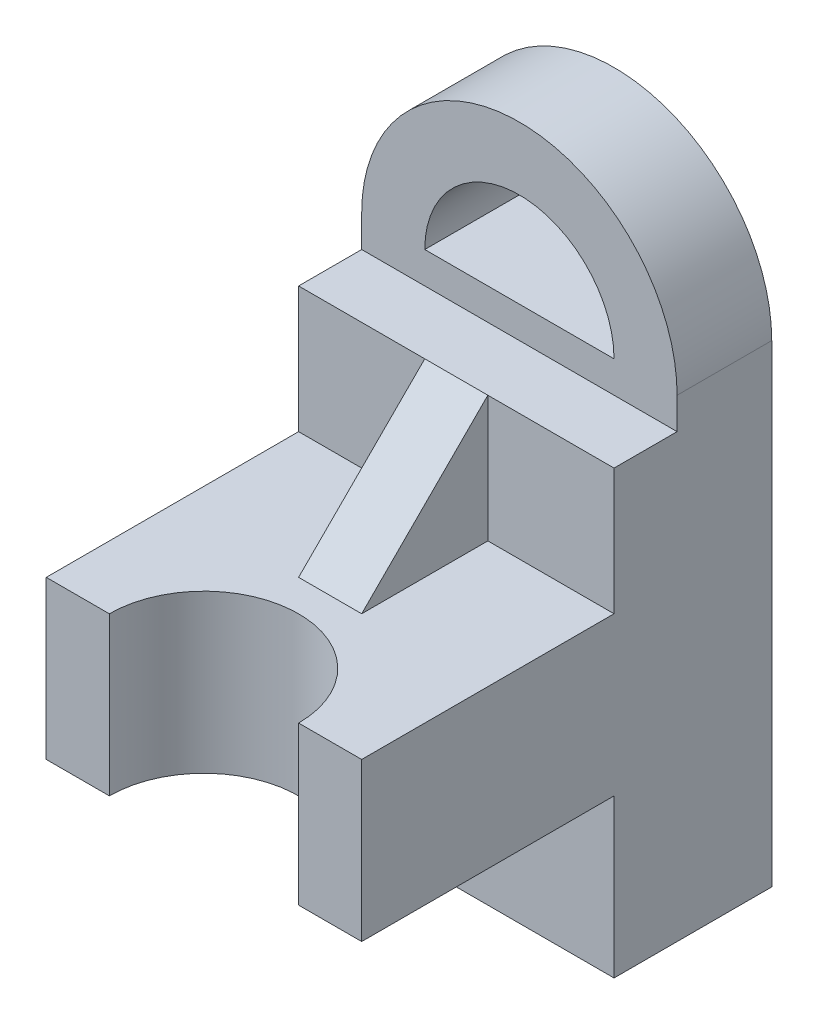
ISO-10303-21;
HEADER;
FILE_DESCRIPTION(('STEP AP214'),'2;1');
FILE_NAME('part.step','',(''),(''),'','','');
FILE_SCHEMA(('AUTOMOTIVE_DESIGN { 1 0 10303 214 1 1 1 1 }'));
ENDSEC;
DATA;
#1=APPLICATION_CONTEXT('core data for automotive mechanical design processes');
#2=APPLICATION_PROTOCOL_DEFINITION('international standard','automotive_design',2000,#1);
#3=PRODUCT_CONTEXT('',#1,'mechanical');
#4=PRODUCT('Part','Part','',(#3));
#5=PRODUCT_RELATED_PRODUCT_CATEGORY('part','',(#4));
#6=PRODUCT_DEFINITION_FORMATION('','',#4);
#7=PRODUCT_DEFINITION_CONTEXT('part definition',#1,'design');
#8=PRODUCT_DEFINITION('design','',#6,#7);
#9=PRODUCT_DEFINITION_SHAPE('','',#8);
#10=(LENGTH_UNIT() NAMED_UNIT(*) SI_UNIT(.MILLI.,.METRE.));
#11=(NAMED_UNIT(*) PLANE_ANGLE_UNIT() SI_UNIT($,.RADIAN.));
#12=(NAMED_UNIT(*) SI_UNIT($,.STERADIAN.) SOLID_ANGLE_UNIT());
#13=UNCERTAINTY_MEASURE_WITH_UNIT(LENGTH_MEASURE(1.E-05),#10,'distance_accuracy_value','');
#14=(GEOMETRIC_REPRESENTATION_CONTEXT(3) GLOBAL_UNCERTAINTY_ASSIGNED_CONTEXT((#13)) GLOBAL_UNIT_ASSIGNED_CONTEXT((#10,
#11,#12)) REPRESENTATION_CONTEXT('',''));
#15=CARTESIAN_POINT('',(0.,0.,0.));
#16=DIRECTION('',(0.,0.,1.));
#17=DIRECTION('',(1.,0.,0.));
#18=AXIS2_PLACEMENT_3D('',#15,#16,#17);
#19=CARTESIAN_POINT('',(25.,-12.5,65.));
#20=DIRECTION('',(0.,0.,1.));
#21=DIRECTION('',(1.,0.,0.));
#22=AXIS2_PLACEMENT_3D('',#19,#20,#21);
#23=PLANE('',#22);
#24=DIRECTION('',(0.,1.,0.));
#25=VECTOR('',#24,1.);
#26=CARTESIAN_POINT('',(15.,-12.5,65.));
#27=LINE('',#26,#25);
#28=CARTESIAN_POINT('',(15.,-12.5,65.));
#29=VERTEX_POINT('',#28);
#30=CARTESIAN_POINT('',(15.,12.5,65.));
#31=VERTEX_POINT('',#30);
#32=EDGE_CURVE('E155',#29,#31,#27,.T.);
#33=ORIENTED_EDGE('',*,*,#32,.F.);
#34=DIRECTION('',(-1.,0.,0.));
#35=VECTOR('',#34,1.);
#36=CARTESIAN_POINT('',(25.,-12.5,65.));
#37=LINE('',#36,#35);
#38=CARTESIAN_POINT('',(25.,-12.5,65.));
#39=VERTEX_POINT('',#38);
#40=EDGE_CURVE('E163',#39,#29,#37,.T.);
#41=ORIENTED_EDGE('',*,*,#40,.F.);
#42=DIRECTION('',(0.,1.,0.));
#43=VECTOR('',#42,1.);
#44=CARTESIAN_POINT('',(25.,-12.5,65.));
#45=LINE('',#44,#43);
#46=CARTESIAN_POINT('',(25.,12.5,65.));
#47=VERTEX_POINT('',#46);
#48=EDGE_CURVE('E322',#39,#47,#45,.T.);
#49=ORIENTED_EDGE('',*,*,#48,.T.);
#50=DIRECTION('',(-1.,0.,0.));
#51=VECTOR('',#50,1.);
#52=CARTESIAN_POINT('',(25.,12.5,65.));
#53=LINE('',#52,#51);
#54=EDGE_CURVE('E165',#47,#31,#53,.T.);
#55=ORIENTED_EDGE('',*,*,#54,.T.);
#56=EDGE_LOOP('',(#33,#41,#49,#55));
#57=FACE_BOUND('',#56,.T.);
#58=ADVANCED_FACE('F37',(#57),#23,.T.);
#59=CARTESIAN_POINT('',(0.,0.,25.));
#60=DIRECTION('',(0.,0.,1.));
#61=DIRECTION('',(1.,0.,0.));
#62=AXIS2_PLACEMENT_3D('',#59,#60,#61);
#63=PLANE('',#62);
#64=DIRECTION('',(-1.,0.,0.));
#65=VECTOR('',#64,1.);
#66=CARTESIAN_POINT('',(25.,12.5,25.));
#67=LINE('',#66,#65);
#68=CARTESIAN_POINT('',(-5.,12.5,25.));
#69=VERTEX_POINT('',#68);
#70=CARTESIAN_POINT('',(-25.,12.5,25.));
#71=VERTEX_POINT('',#70);
#72=EDGE_CURVE('E283',#69,#71,#67,.T.);
#73=ORIENTED_EDGE('',*,*,#72,.F.);
#74=DIRECTION('',(0.,1.,0.));
#75=VECTOR('',#74,1.);
#76=CARTESIAN_POINT('',(-5.,0.,25.));
#77=LINE('',#76,#75);
#78=CARTESIAN_POINT('',(-5.,32.5,25.));
#79=VERTEX_POINT('',#78);
#80=EDGE_CURVE('E59',#69,#79,#77,.T.);
#81=ORIENTED_EDGE('',*,*,#80,.T.);
#82=DIRECTION('',(1.,0.,0.));
#83=VECTOR('',#82,1.);
#84=CARTESIAN_POINT('',(-25.,32.5,25.));
#85=LINE('',#84,#83);
#86=CARTESIAN_POINT('',(-25.,32.5,25.));
#87=VERTEX_POINT('',#86);
#88=EDGE_CURVE('E181',#87,#79,#85,.T.);
#89=ORIENTED_EDGE('',*,*,#88,.F.);
#90=DIRECTION('',(0.,1.,0.));
#91=VECTOR('',#90,1.);
#92=CARTESIAN_POINT('',(-25.,-37.5,25.));
#93=LINE('',#92,#91);
#94=EDGE_CURVE('E191',#71,#87,#93,.T.);
#95=ORIENTED_EDGE('',*,*,#94,.F.);
#96=EDGE_LOOP('',(#73,#81,#89,#95));
#97=FACE_BOUND('',#96,.T.);
#98=ADVANCED_FACE('F296',(#97),#63,.T.);
#99=DIRECTION('',(-1.,0.,0.));
#100=VECTOR('',#99,1.);
#101=CARTESIAN_POINT('',(25.,-12.5,25.));
#102=LINE('',#101,#100);
#103=CARTESIAN_POINT('',(25.,-12.5,25.));
#104=VERTEX_POINT('',#103);
#105=CARTESIAN_POINT('',(-25.,-12.5,25.));
#106=VERTEX_POINT('',#105);
#107=EDGE_CURVE('E176',#104,#106,#102,.T.);
#108=ORIENTED_EDGE('',*,*,#107,.T.);
#109=CARTESIAN_POINT('',(-25.,-37.5,25.));
#110=VERTEX_POINT('',#109);
#111=EDGE_CURVE('E192',#110,#106,#93,.T.);
#112=ORIENTED_EDGE('',*,*,#111,.F.);
#113=DIRECTION('',(1.,0.,0.));
#114=VECTOR('',#113,1.);
#115=CARTESIAN_POINT('',(-25.,-37.5,25.));
#116=LINE('',#115,#114);
#117=CARTESIAN_POINT('',(25.,-37.5,25.));
#118=VERTEX_POINT('',#117);
#119=EDGE_CURVE('E189',#110,#118,#116,.T.);
#120=ORIENTED_EDGE('',*,*,#119,.T.);
#121=DIRECTION('',(0.,1.,0.));
#122=VECTOR('',#121,1.);
#123=CARTESIAN_POINT('',(25.,-37.5,25.));
#124=LINE('',#123,#122);
#125=EDGE_CURVE('E186',#118,#104,#124,.T.);
#126=ORIENTED_EDGE('',*,*,#125,.T.);
#127=EDGE_LOOP('',(#108,#112,#120,#126));
#128=FACE_BOUND('',#127,.T.);
#129=ADVANCED_FACE('F264',(#128),#63,.T.);
#130=CARTESIAN_POINT('',(0.,37.5,15.));
#131=DIRECTION('',(0.,0.,1.));
#132=DIRECTION('',(1.,0.,0.));
#133=AXIS2_PLACEMENT_3D('',#130,#131,#132);
#134=PLANE('',#133);
#135=CARTESIAN_POINT('',(0.,37.5,15.));
#136=DIRECTION('',(0.,0.,1.));
#137=DIRECTION('',(1.,0.,0.));
#138=AXIS2_PLACEMENT_3D('',#135,#136,#137);
#139=CIRCLE('',#138,15.);
#140=CARTESIAN_POINT('',(15.,37.5,15.));
#141=VERTEX_POINT('',#140);
#142=CARTESIAN_POINT('',(-15.,37.5,15.));
#143=VERTEX_POINT('',#142);
#144=EDGE_CURVE('E201',#141,#143,#139,.T.);
#145=ORIENTED_EDGE('',*,*,#144,.F.);
#146=DIRECTION('',(1.,0.,0.));
#147=VECTOR('',#146,1.);
#148=CARTESIAN_POINT('',(-15.,37.5,15.));
#149=LINE('',#148,#147);
#150=EDGE_CURVE('E207',#143,#141,#149,.T.);
#151=ORIENTED_EDGE('',*,*,#150,.F.);
#152=EDGE_LOOP('',(#145,#151));
#153=FACE_BOUND('',#152,.T.);
#154=DIRECTION('',(1.,0.,0.));
#155=VECTOR('',#154,1.);
#156=CARTESIAN_POINT('',(-25.,32.5,15.));
#157=LINE('',#156,#155);
#158=CARTESIAN_POINT('',(-25.,32.5,15.));
#159=VERTEX_POINT('',#158);
#160=CARTESIAN_POINT('',(25.,32.5,15.));
#161=VERTEX_POINT('',#160);
#162=EDGE_CURVE('E196',#159,#161,#157,.T.);
#163=ORIENTED_EDGE('',*,*,#162,.T.);
#164=DIRECTION('',(0.,1.,0.));
#165=VECTOR('',#164,1.);
#166=CARTESIAN_POINT('',(25.,37.5,15.));
#167=LINE('',#166,#165);
#168=CARTESIAN_POINT('',(25.,37.5,15.));
#169=VERTEX_POINT('',#168);
#170=EDGE_CURVE('E218',#161,#169,#167,.T.);
#171=ORIENTED_EDGE('',*,*,#170,.T.);
#172=CARTESIAN_POINT('',(0.,37.5,15.));
#173=DIRECTION('',(0.,0.,1.));
#174=DIRECTION('',(1.,0.,0.));
#175=AXIS2_PLACEMENT_3D('',#172,#173,#174);
#176=CIRCLE('',#175,25.);
#177=CARTESIAN_POINT('',(-25.,37.5,15.));
#178=VERTEX_POINT('',#177);
#179=EDGE_CURVE('E220',#169,#178,#176,.T.);
#180=ORIENTED_EDGE('',*,*,#179,.T.);
#181=DIRECTION('',(0.,-1.,0.));
#182=VECTOR('',#181,1.);
#183=CARTESIAN_POINT('',(-25.,37.5,15.));
#184=LINE('',#183,#182);
#185=EDGE_CURVE('E223',#178,#159,#184,.T.);
#186=ORIENTED_EDGE('',*,*,#185,.T.);
#187=EDGE_LOOP('',(#163,#171,#180,#186));
#188=FACE_BOUND('',#187,.T.);
#189=ADVANCED_FACE('F302',(#153,#188),#134,.T.);
#190=CARTESIAN_POINT('',(25.,37.5,15.));
#191=DIRECTION('',(-1.,0.,0.));
#192=DIRECTION('',(0.,-1.,0.));
#193=AXIS2_PLACEMENT_3D('',#190,#191,#192);
#194=PLANE('',#193);
#195=DIRECTION('',(0.,1.,0.));
#196=VECTOR('',#195,1.);
#197=CARTESIAN_POINT('',(25.,37.5,0.));
#198=LINE('',#197,#196);
#199=CARTESIAN_POINT('',(25.,-37.5,0.));
#200=VERTEX_POINT('',#199);
#201=CARTESIAN_POINT('',(25.,37.5,0.));
#202=VERTEX_POINT('',#201);
#203=EDGE_CURVE('E215',#200,#202,#198,.T.);
#204=ORIENTED_EDGE('',*,*,#203,.T.);
#205=DIRECTION('',(0.,0.,-1.));
#206=VECTOR('',#205,1.);
#207=CARTESIAN_POINT('',(25.,37.5,15.));
#208=LINE('',#207,#206);
#209=EDGE_CURVE('E45',#169,#202,#208,.T.);
#210=ORIENTED_EDGE('',*,*,#209,.F.);
#211=ORIENTED_EDGE('',*,*,#170,.F.);
#212=DIRECTION('',(0.,0.,-1.));
#213=VECTOR('',#212,1.);
#214=CARTESIAN_POINT('',(25.,32.5,25.));
#215=LINE('',#214,#213);
#216=CARTESIAN_POINT('',(25.,32.5,25.));
#217=VERTEX_POINT('',#216);
#218=EDGE_CURVE('E195',#217,#161,#215,.T.);
#219=ORIENTED_EDGE('',*,*,#218,.F.);
#220=CARTESIAN_POINT('',(25.,12.5,25.));
#221=VERTEX_POINT('',#220);
#222=EDGE_CURVE('E184',#221,#217,#124,.T.);
#223=ORIENTED_EDGE('',*,*,#222,.F.);
#224=DIRECTION('',(0.,0.,-1.));
#225=VECTOR('',#224,1.);
#226=CARTESIAN_POINT('',(25.,12.5,25.));
#227=LINE('',#226,#225);
#228=EDGE_CURVE('E180',#47,#221,#227,.T.);
#229=ORIENTED_EDGE('',*,*,#228,.F.);
#230=ORIENTED_EDGE('',*,*,#48,.F.);
#231=DIRECTION('',(0.,0.,1.));
#232=VECTOR('',#231,1.);
#233=CARTESIAN_POINT('',(25.,-12.5,25.));
#234=LINE('',#233,#232);
#235=EDGE_CURVE('E171',#104,#39,#234,.T.);
#236=ORIENTED_EDGE('',*,*,#235,.F.);
#237=ORIENTED_EDGE('',*,*,#125,.F.);
#238=DIRECTION('',(0.,0.,-1.));
#239=VECTOR('',#238,1.);
#240=CARTESIAN_POINT('',(25.,-37.5,15.));
#241=LINE('',#240,#239);
#242=EDGE_CURVE('E226',#118,#200,#241,.T.);
#243=ORIENTED_EDGE('',*,*,#242,.T.);
#244=EDGE_LOOP('',(#204,#210,#211,#219,#223,#229,#230,#236,#237,#243));
#245=FACE_BOUND('',#244,.T.);
#246=ADVANCED_FACE('F39',(#245),#194,.F.);
#247=CARTESIAN_POINT('',(0.,37.5,15.));
#248=DIRECTION('',(0.,0.,-1.));
#249=DIRECTION('',(-1.,0.,0.));
#250=AXIS2_PLACEMENT_3D('',#247,#248,#249);
#251=CYLINDRICAL_SURFACE('',#250,25.);
#252=CARTESIAN_POINT('',(0.,37.5,0.));
#253=DIRECTION('',(0.,0.,1.));
#254=DIRECTION('',(1.,0.,0.));
#255=AXIS2_PLACEMENT_3D('',#252,#253,#254);
#256=CIRCLE('',#255,25.);
#257=CARTESIAN_POINT('',(-25.,37.5,0.));
#258=VERTEX_POINT('',#257);
#259=EDGE_CURVE('E229',#202,#258,#256,.T.);
#260=ORIENTED_EDGE('',*,*,#259,.T.);
#261=DIRECTION('',(0.,0.,-1.));
#262=VECTOR('',#261,1.);
#263=CARTESIAN_POINT('',(-25.,37.5,15.));
#264=LINE('',#263,#262);
#265=EDGE_CURVE('E239',#178,#258,#264,.T.);
#266=ORIENTED_EDGE('',*,*,#265,.F.);
#267=ORIENTED_EDGE('',*,*,#179,.F.);
#268=ORIENTED_EDGE('',*,*,#209,.T.);
#269=EDGE_LOOP('',(#260,#266,#267,#268));
#270=FACE_BOUND('',#269,.T.);
#271=ADVANCED_FACE('F245',(#270),#251,.T.);
#272=CARTESIAN_POINT('',(-25.,37.5,15.));
#273=DIRECTION('',(1.,0.,0.));
#274=DIRECTION('',(0.,1.,0.));
#275=AXIS2_PLACEMENT_3D('',#272,#273,#274);
#276=PLANE('',#275);
#277=DIRECTION('',(0.,-1.,0.));
#278=VECTOR('',#277,1.);
#279=CARTESIAN_POINT('',(-25.,37.5,0.));
#280=LINE('',#279,#278);
#281=CARTESIAN_POINT('',(-25.,-37.5,0.));
#282=VERTEX_POINT('',#281);
#283=EDGE_CURVE('E231',#258,#282,#280,.T.);
#284=ORIENTED_EDGE('',*,*,#283,.T.);
#285=DIRECTION('',(0.,0.,-1.));
#286=VECTOR('',#285,1.);
#287=CARTESIAN_POINT('',(-25.,-37.5,15.));
#288=LINE('',#287,#286);
#289=EDGE_CURVE('E236',#110,#282,#288,.T.);
#290=ORIENTED_EDGE('',*,*,#289,.F.);
#291=ORIENTED_EDGE('',*,*,#111,.T.);
#292=DIRECTION('',(0.,0.,1.));
#293=VECTOR('',#292,1.);
#294=CARTESIAN_POINT('',(-25.,-12.5,25.));
#295=LINE('',#294,#293);
#296=CARTESIAN_POINT('',(-25.,-12.5,65.));
#297=VERTEX_POINT('',#296);
#298=EDGE_CURVE('E268',#106,#297,#295,.T.);
#299=ORIENTED_EDGE('',*,*,#298,.T.);
#300=DIRECTION('',(0.,1.,0.));
#301=VECTOR('',#300,1.);
#302=CARTESIAN_POINT('',(-25.,-12.5,65.));
#303=LINE('',#302,#301);
#304=CARTESIAN_POINT('',(-25.,12.5,65.));
#305=VERTEX_POINT('',#304);
#306=EDGE_CURVE('E271',#297,#305,#303,.T.);
#307=ORIENTED_EDGE('',*,*,#306,.T.);
#308=DIRECTION('',(0.,0.,-1.));
#309=VECTOR('',#308,1.);
#310=CARTESIAN_POINT('',(-25.,12.5,25.));
#311=LINE('',#310,#309);
#312=EDGE_CURVE('E275',#305,#71,#311,.T.);
#313=ORIENTED_EDGE('',*,*,#312,.T.);
#314=ORIENTED_EDGE('',*,*,#94,.T.);
#315=DIRECTION('',(0.,0.,-1.));
#316=VECTOR('',#315,1.);
#317=CARTESIAN_POINT('',(-25.,32.5,25.));
#318=LINE('',#317,#316);
#319=EDGE_CURVE('E199',#87,#159,#318,.T.);
#320=ORIENTED_EDGE('',*,*,#319,.T.);
#321=ORIENTED_EDGE('',*,*,#185,.F.);
#322=ORIENTED_EDGE('',*,*,#265,.T.);
#323=EDGE_LOOP('',(#284,#290,#291,#299,#307,#313,#314,#320,#321,#322));
#324=FACE_BOUND('',#323,.T.);
#325=ADVANCED_FACE('F257',(#324),#276,.F.);
#326=CARTESIAN_POINT('',(-25.,-37.5,15.));
#327=DIRECTION('',(0.,1.,0.));
#328=DIRECTION('',(0.,0.,1.));
#329=AXIS2_PLACEMENT_3D('',#326,#327,#328);
#330=PLANE('',#329);
#331=ORIENTED_EDGE('',*,*,#242,.F.);
#332=ORIENTED_EDGE('',*,*,#119,.F.);
#333=ORIENTED_EDGE('',*,*,#289,.T.);
#334=DIRECTION('',(1.,0.,0.));
#335=VECTOR('',#334,1.);
#336=CARTESIAN_POINT('',(-25.,-37.5,0.));
#337=LINE('',#336,#335);
#338=EDGE_CURVE('E221',#282,#200,#337,.T.);
#339=ORIENTED_EDGE('',*,*,#338,.T.);
#340=EDGE_LOOP('',(#331,#332,#333,#339));
#341=FACE_BOUND('',#340,.T.);
#342=ADVANCED_FACE('F261',(#341),#330,.F.);
#343=CARTESIAN_POINT('',(0.,37.5,0.));
#344=DIRECTION('',(0.,0.,1.));
#345=DIRECTION('',(1.,0.,0.));
#346=AXIS2_PLACEMENT_3D('',#343,#344,#345);
#347=PLANE('',#346);
#348=DIRECTION('',(1.,0.,0.));
#349=VECTOR('',#348,1.);
#350=CARTESIAN_POINT('',(-15.,37.5,0.));
#351=LINE('',#350,#349);
#352=CARTESIAN_POINT('',(-15.,37.5,0.));
#353=VERTEX_POINT('',#352);
#354=CARTESIAN_POINT('',(15.,37.5,0.));
#355=VERTEX_POINT('',#354);
#356=EDGE_CURVE('E206',#353,#355,#351,.T.);
#357=ORIENTED_EDGE('',*,*,#356,.T.);
#358=CARTESIAN_POINT('',(0.,37.5,0.));
#359=DIRECTION('',(0.,0.,1.));
#360=DIRECTION('',(1.,0.,0.));
#361=AXIS2_PLACEMENT_3D('',#358,#359,#360);
#362=CIRCLE('',#361,15.);
#363=EDGE_CURVE('E204',#355,#353,#362,.T.);
#364=ORIENTED_EDGE('',*,*,#363,.T.);
#365=EDGE_LOOP('',(#357,#364));
#366=FACE_BOUND('',#365,.T.);
#367=ORIENTED_EDGE('',*,*,#203,.F.);
#368=ORIENTED_EDGE('',*,*,#338,.F.);
#369=ORIENTED_EDGE('',*,*,#283,.F.);
#370=ORIENTED_EDGE('',*,*,#259,.F.);
#371=EDGE_LOOP('',(#367,#368,#369,#370));
#372=FACE_BOUND('',#371,.T.);
#373=ADVANCED_FACE('F254',(#366,#372),#347,.F.);
#374=CARTESIAN_POINT('',(0.,37.5,0.));
#375=DIRECTION('',(0.,0.,1.));
#376=DIRECTION('',(1.,0.,0.));
#377=AXIS2_PLACEMENT_3D('',#374,#375,#376);
#378=CYLINDRICAL_SURFACE('',#377,15.);
#379=DIRECTION('',(0.,0.,1.));
#380=VECTOR('',#379,1.);
#381=CARTESIAN_POINT('',(-15.,37.5,0.));
#382=LINE('',#381,#380);
#383=EDGE_CURVE('E209',#353,#143,#382,.T.);
#384=ORIENTED_EDGE('',*,*,#383,.F.);
#385=ORIENTED_EDGE('',*,*,#363,.F.);
#386=DIRECTION('',(0.,0.,1.));
#387=VECTOR('',#386,1.);
#388=CARTESIAN_POINT('',(15.,37.5,0.));
#389=LINE('',#388,#387);
#390=EDGE_CURVE('E212',#355,#141,#389,.T.);
#391=ORIENTED_EDGE('',*,*,#390,.T.);
#392=ORIENTED_EDGE('',*,*,#144,.T.);
#393=EDGE_LOOP('',(#384,#385,#391,#392));
#394=FACE_BOUND('',#393,.T.);
#395=ADVANCED_FACE('F378',(#394),#378,.F.);
#396=CARTESIAN_POINT('',(-15.,37.5,0.));
#397=DIRECTION('',(0.,-1.,0.));
#398=DIRECTION('',(0.,0.,-1.));
#399=AXIS2_PLACEMENT_3D('',#396,#397,#398);
#400=PLANE('',#399);
#401=ORIENTED_EDGE('',*,*,#390,.F.);
#402=ORIENTED_EDGE('',*,*,#356,.F.);
#403=ORIENTED_EDGE('',*,*,#383,.T.);
#404=ORIENTED_EDGE('',*,*,#150,.T.);
#405=EDGE_LOOP('',(#401,#402,#403,#404));
#406=FACE_BOUND('',#405,.T.);
#407=ADVANCED_FACE('F364',(#406),#400,.F.);
#408=CARTESIAN_POINT('',(-25.,32.5,25.));
#409=DIRECTION('',(0.,1.,0.));
#410=DIRECTION('',(0.,0.,1.));
#411=AXIS2_PLACEMENT_3D('',#408,#409,#410);
#412=PLANE('',#411);
#413=ORIENTED_EDGE('',*,*,#218,.T.);
#414=ORIENTED_EDGE('',*,*,#162,.F.);
#415=ORIENTED_EDGE('',*,*,#319,.F.);
#416=ORIENTED_EDGE('',*,*,#88,.T.);
#417=DIRECTION('',(-1.,0.,0.));
#418=VECTOR('',#417,1.);
#419=CARTESIAN_POINT('',(0.,32.5,25.));
#420=LINE('',#419,#418);
#421=CARTESIAN_POINT('',(5.,32.5,25.));
#422=VERTEX_POINT('',#421);
#423=EDGE_CURVE('E273',#422,#79,#420,.T.);
#424=ORIENTED_EDGE('',*,*,#423,.F.);
#425=EDGE_CURVE('E185',#422,#217,#85,.T.);
#426=ORIENTED_EDGE('',*,*,#425,.T.);
#427=EDGE_LOOP('',(#413,#414,#415,#416,#424,#426));
#428=FACE_BOUND('',#427,.T.);
#429=ADVANCED_FACE('F299',(#428),#412,.T.);
#430=DIRECTION('',(0.,1.,0.));
#431=VECTOR('',#430,1.);
#432=CARTESIAN_POINT('',(5.,0.,25.));
#433=LINE('',#432,#431);
#434=CARTESIAN_POINT('',(5.,12.5,25.));
#435=VERTEX_POINT('',#434);
#436=EDGE_CURVE('E311',#435,#422,#433,.T.);
#437=ORIENTED_EDGE('',*,*,#436,.F.);
#438=EDGE_CURVE('E198',#221,#435,#67,.T.);
#439=ORIENTED_EDGE('',*,*,#438,.F.);
#440=ORIENTED_EDGE('',*,*,#222,.T.);
#441=ORIENTED_EDGE('',*,*,#425,.F.);
#442=EDGE_LOOP('',(#437,#439,#440,#441));
#443=FACE_BOUND('',#442,.T.);
#444=ADVANCED_FACE('F310',(#443),#63,.T.);
#445=CARTESIAN_POINT('',(25.,12.5,25.));
#446=DIRECTION('',(0.,1.,0.));
#447=DIRECTION('',(-1.,0.,0.));
#448=AXIS2_PLACEMENT_3D('',#445,#446,#447);
#449=PLANE('',#448);
#450=CARTESIAN_POINT('',(0.,12.5,65.));
#451=DIRECTION('',(0.,1.,0.));
#452=DIRECTION('',(-1.,0.,0.));
#453=AXIS2_PLACEMENT_3D('',#450,#451,#452);
#454=CIRCLE('',#453,15.);
#455=CARTESIAN_POINT('',(-15.,12.5,65.));
#456=VERTEX_POINT('',#455);
#457=EDGE_CURVE('E323',#31,#456,#454,.T.);
#458=ORIENTED_EDGE('',*,*,#457,.F.);
#459=ORIENTED_EDGE('',*,*,#54,.F.);
#460=ORIENTED_EDGE('',*,*,#228,.T.);
#461=ORIENTED_EDGE('',*,*,#438,.T.);
#462=DIRECTION('',(0.,0.,-1.));
#463=VECTOR('',#462,1.);
#464=CARTESIAN_POINT('',(5.,12.5,25.));
#465=LINE('',#464,#463);
#466=CARTESIAN_POINT('',(5.,12.5,45.));
#467=VERTEX_POINT('',#466);
#468=EDGE_CURVE('E315',#467,#435,#465,.T.);
#469=ORIENTED_EDGE('',*,*,#468,.F.);
#470=DIRECTION('',(1.,0.,0.));
#471=VECTOR('',#470,1.);
#472=CARTESIAN_POINT('',(25.,12.5,45.));
#473=LINE('',#472,#471);
#474=CARTESIAN_POINT('',(-5.,12.5,45.));
#475=VERTEX_POINT('',#474);
#476=EDGE_CURVE('E277',#475,#467,#473,.T.);
#477=ORIENTED_EDGE('',*,*,#476,.F.);
#478=DIRECTION('',(0.,0.,-1.));
#479=VECTOR('',#478,1.);
#480=CARTESIAN_POINT('',(-5.,12.5,25.));
#481=LINE('',#480,#479);
#482=EDGE_CURVE('E291',#475,#69,#481,.T.);
#483=ORIENTED_EDGE('',*,*,#482,.T.);
#484=ORIENTED_EDGE('',*,*,#72,.T.);
#485=ORIENTED_EDGE('',*,*,#312,.F.);
#486=EDGE_CURVE('E172',#456,#305,#53,.T.);
#487=ORIENTED_EDGE('',*,*,#486,.F.);
#488=EDGE_LOOP('',(#458,#459,#460,#461,#469,#477,#483,#484,#485,#487));
#489=FACE_BOUND('',#488,.T.);
#490=ADVANCED_FACE('F288',(#489),#449,.T.);
#491=DIRECTION('',(0.,1.,0.));
#492=VECTOR('',#491,1.);
#493=CARTESIAN_POINT('',(-15.,-12.5,65.));
#494=LINE('',#493,#492);
#495=CARTESIAN_POINT('',(-15.,-12.5,65.));
#496=VERTEX_POINT('',#495);
#497=EDGE_CURVE('E51',#456,#496,#494,.F.);
#498=ORIENTED_EDGE('',*,*,#497,.F.);
#499=ORIENTED_EDGE('',*,*,#486,.T.);
#500=ORIENTED_EDGE('',*,*,#306,.F.);
#501=EDGE_CURVE('E173',#496,#297,#37,.T.);
#502=ORIENTED_EDGE('',*,*,#501,.F.);
#503=EDGE_LOOP('',(#498,#499,#500,#502));
#504=FACE_BOUND('',#503,.T.);
#505=ADVANCED_FACE('F345',(#504),#23,.T.);
#506=CARTESIAN_POINT('',(25.,-12.5,25.));
#507=DIRECTION('',(0.,-1.,0.));
#508=DIRECTION('',(1.,0.,0.));
#509=AXIS2_PLACEMENT_3D('',#506,#507,#508);
#510=PLANE('',#509);
#511=CARTESIAN_POINT('',(0.,-12.5,65.));
#512=DIRECTION('',(0.,-1.,0.));
#513=DIRECTION('',(1.,0.,0.));
#514=AXIS2_PLACEMENT_3D('',#511,#512,#513);
#515=CIRCLE('',#514,15.);
#516=EDGE_CURVE('E11',#496,#29,#515,.T.);
#517=ORIENTED_EDGE('',*,*,#516,.F.);
#518=ORIENTED_EDGE('',*,*,#501,.T.);
#519=ORIENTED_EDGE('',*,*,#298,.F.);
#520=ORIENTED_EDGE('',*,*,#107,.F.);
#521=ORIENTED_EDGE('',*,*,#235,.T.);
#522=ORIENTED_EDGE('',*,*,#40,.T.);
#523=EDGE_LOOP('',(#517,#518,#519,#520,#521,#522));
#524=FACE_BOUND('',#523,.T.);
#525=ADVANCED_FACE('F169',(#524),#510,.T.);
#526=CARTESIAN_POINT('',(0.,32.5,25.));
#527=DIRECTION('',(0.,0.707106781186547,0.707106781186548));
#528=DIRECTION('',(0.,-0.707106781186548,0.707106781186547));
#529=AXIS2_PLACEMENT_3D('',#526,#527,#528);
#530=PLANE('',#529);
#531=DIRECTION('',(0.,-0.707106781186548,0.707106781186547));
#532=VECTOR('',#531,1.);
#533=CARTESIAN_POINT('',(5.,32.5,25.));
#534=LINE('',#533,#532);
#535=EDGE_CURVE('E327',#422,#467,#534,.T.);
#536=ORIENTED_EDGE('',*,*,#535,.F.);
#537=ORIENTED_EDGE('',*,*,#423,.T.);
#538=DIRECTION('',(0.,-0.707106781186548,0.707106781186547));
#539=VECTOR('',#538,1.);
#540=CARTESIAN_POINT('',(-5.,32.5,25.));
#541=LINE('',#540,#539);
#542=EDGE_CURVE('E166',#79,#475,#541,.T.);
#543=ORIENTED_EDGE('',*,*,#542,.T.);
#544=ORIENTED_EDGE('',*,*,#476,.T.);
#545=EDGE_LOOP('',(#536,#537,#543,#544));
#546=FACE_BOUND('',#545,.T.);
#547=ADVANCED_FACE('F331',(#546),#530,.T.);
#548=CARTESIAN_POINT('',(5.,12.5,32.5));
#549=DIRECTION('',(1.,0.,0.));
#550=DIRECTION('',(0.,0.,-1.));
#551=AXIS2_PLACEMENT_3D('',#548,#549,#550);
#552=PLANE('',#551);
#553=ORIENTED_EDGE('',*,*,#535,.T.);
#554=ORIENTED_EDGE('',*,*,#468,.T.);
#555=ORIENTED_EDGE('',*,*,#436,.T.);
#556=EDGE_LOOP('',(#553,#554,#555));
#557=FACE_BOUND('',#556,.T.);
#558=ADVANCED_FACE('F332',(#557),#552,.T.);
#559=CARTESIAN_POINT('',(-5.,12.5,32.5));
#560=DIRECTION('',(1.,0.,0.));
#561=DIRECTION('',(0.,0.,-1.));
#562=AXIS2_PLACEMENT_3D('',#559,#560,#561);
#563=PLANE('',#562);
#564=ORIENTED_EDGE('',*,*,#482,.F.);
#565=ORIENTED_EDGE('',*,*,#542,.F.);
#566=ORIENTED_EDGE('',*,*,#80,.F.);
#567=EDGE_LOOP('',(#564,#565,#566));
#568=FACE_BOUND('',#567,.T.);
#569=ADVANCED_FACE('F334',(#568),#563,.F.);
#570=CARTESIAN_POINT('',(0.,-12.5,65.));
#571=DIRECTION('',(0.,1.,0.));
#572=DIRECTION('',(-1.,0.,0.));
#573=AXIS2_PLACEMENT_3D('',#570,#571,#572);
#574=CYLINDRICAL_SURFACE('',#573,15.);
#575=ORIENTED_EDGE('',*,*,#32,.T.);
#576=ORIENTED_EDGE('',*,*,#457,.T.);
#577=ORIENTED_EDGE('',*,*,#497,.T.);
#578=ORIENTED_EDGE('',*,*,#516,.T.);
#579=EDGE_LOOP('',(#575,#576,#577,#578));
#580=FACE_BOUND('',#579,.T.);
#581=ADVANCED_FACE('F154',(#580),#574,.F.);
#582=CLOSED_SHELL('',(#58,#98,#129,#189,#246,#271,#325,#342,#373,#395,#407,#429,#444,#490,#505,
#525,#547,#558,#569,#581));
#583=MANIFOLD_SOLID_BREP('B2',#582);
#584=ADVANCED_BREP_SHAPE_REPRESENTATION('',(#18,#583),#14);
#585=SHAPE_DEFINITION_REPRESENTATION(#9,#584);
ENDSEC;
END-ISO-10303-21;
